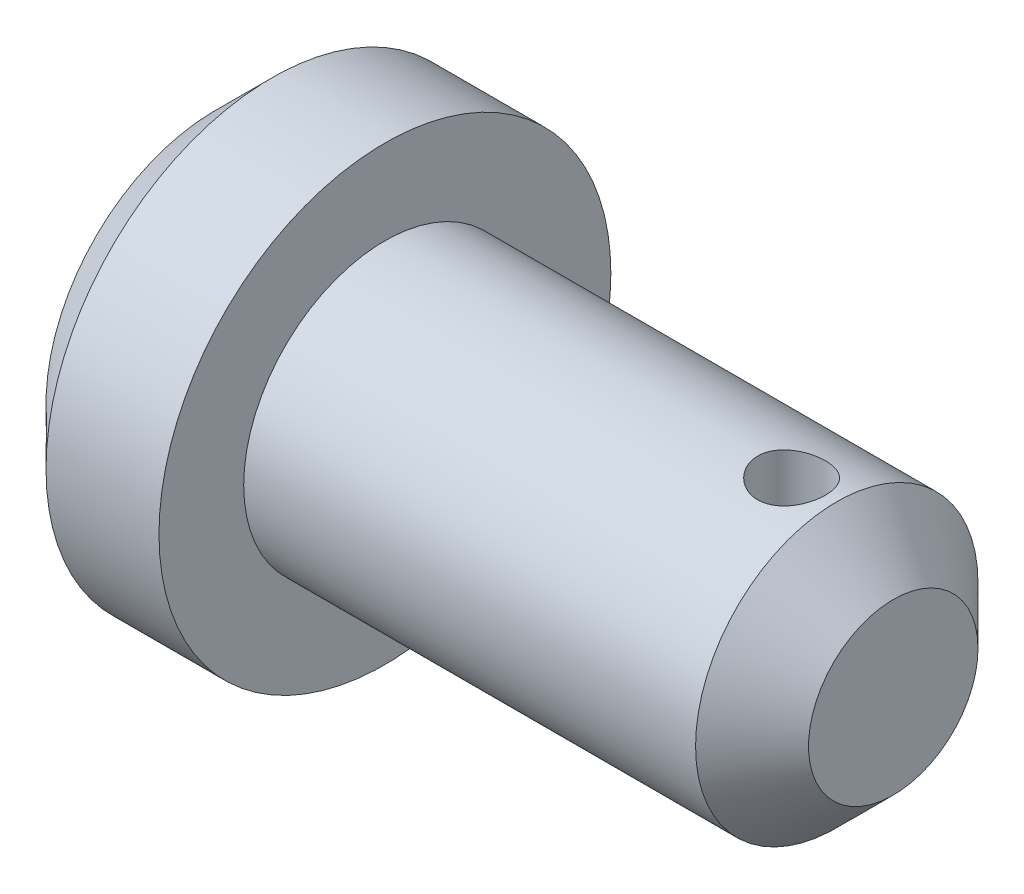
ISO-10303-21;
HEADER;
FILE_DESCRIPTION(('STEP AP214'),'2;1');
FILE_NAME('part.step','',(''),(''),'','','');
FILE_SCHEMA(('AUTOMOTIVE_DESIGN { 1 0 10303 214 1 1 1 1 }'));
ENDSEC;
DATA;
#1=APPLICATION_CONTEXT('core data for automotive mechanical design processes');
#2=APPLICATION_PROTOCOL_DEFINITION('international standard','automotive_design',2000,#1);
#3=PRODUCT_CONTEXT('',#1,'mechanical');
#4=PRODUCT('Part','Part','',(#3));
#5=PRODUCT_RELATED_PRODUCT_CATEGORY('part','',(#4));
#6=PRODUCT_DEFINITION_FORMATION('','',#4);
#7=PRODUCT_DEFINITION_CONTEXT('part definition',#1,'design');
#8=PRODUCT_DEFINITION('design','',#6,#7);
#9=PRODUCT_DEFINITION_SHAPE('','',#8);
#10=(LENGTH_UNIT() NAMED_UNIT(*) SI_UNIT(.MILLI.,.METRE.));
#11=(NAMED_UNIT(*) PLANE_ANGLE_UNIT() SI_UNIT($,.RADIAN.));
#12=(NAMED_UNIT(*) SI_UNIT($,.STERADIAN.) SOLID_ANGLE_UNIT());
#13=UNCERTAINTY_MEASURE_WITH_UNIT(LENGTH_MEASURE(1.E-05),#10,'distance_accuracy_value','');
#14=(GEOMETRIC_REPRESENTATION_CONTEXT(3) GLOBAL_UNCERTAINTY_ASSIGNED_CONTEXT((#13)) GLOBAL_UNIT_ASSIGNED_CONTEXT((#10,
#11,#12)) REPRESENTATION_CONTEXT('',''));
#15=CARTESIAN_POINT('',(0.,0.,0.));
#16=DIRECTION('',(0.,0.,1.));
#17=DIRECTION('',(1.,0.,0.));
#18=AXIS2_PLACEMENT_3D('',#15,#16,#17);
#19=CARTESIAN_POINT('',(30.,0.,0.));
#20=DIRECTION('',(-1.,0.,0.));
#21=DIRECTION('',(0.,0.,1.));
#22=AXIS2_PLACEMENT_3D('',#19,#20,#21);
#23=CYLINDRICAL_SURFACE('',#22,40.);
#24=CARTESIAN_POINT('',(9.99999999999999,0.,0.));
#25=DIRECTION('',(1.,0.,0.));
#26=DIRECTION('',(0.,0.,-1.));
#27=AXIS2_PLACEMENT_3D('',#24,#25,#26);
#28=CIRCLE('',#27,40.);
#29=CARTESIAN_POINT('',(9.99999999999999,0.,-40.));
#30=VERTEX_POINT('',#29);
#31=EDGE_CURVE('E103',#30,#30,#28,.T.);
#32=ORIENTED_EDGE('',*,*,#31,.T.);
#33=EDGE_LOOP('',(#32));
#34=FACE_BOUND('',#33,.T.);
#35=CARTESIAN_POINT('',(30.,0.,0.));
#36=DIRECTION('',(1.,0.,0.));
#37=DIRECTION('',(0.,0.,-1.));
#38=AXIS2_PLACEMENT_3D('',#35,#36,#37);
#39=CIRCLE('',#38,40.);
#40=CARTESIAN_POINT('',(30.,0.,-40.));
#41=VERTEX_POINT('',#40);
#42=EDGE_CURVE('E104',#41,#41,#39,.T.);
#43=ORIENTED_EDGE('',*,*,#42,.F.);
#44=EDGE_LOOP('',(#43));
#45=FACE_BOUND('',#44,.T.);
#46=ADVANCED_FACE('F33',(#34,#45),#23,.T.);
#47=CARTESIAN_POINT('',(30.,0.,0.));
#48=DIRECTION('',(1.,0.,0.));
#49=DIRECTION('',(0.,0.,-1.));
#50=AXIS2_PLACEMENT_3D('',#47,#48,#49);
#51=PLANE('',#50);
#52=CARTESIAN_POINT('',(30.,0.,0.));
#53=DIRECTION('',(1.,0.,0.));
#54=DIRECTION('',(0.,0.,-1.));
#55=AXIS2_PLACEMENT_3D('',#52,#53,#54);
#56=CIRCLE('',#55,25.);
#57=CARTESIAN_POINT('',(30.,0.,-25.));
#58=VERTEX_POINT('',#57);
#59=EDGE_CURVE('E106',#58,#58,#56,.T.);
#60=ORIENTED_EDGE('',*,*,#59,.F.);
#61=EDGE_LOOP('',(#60));
#62=FACE_BOUND('',#61,.T.);
#63=ORIENTED_EDGE('',*,*,#42,.T.);
#64=EDGE_LOOP('',(#63));
#65=FACE_BOUND('',#64,.T.);
#66=ADVANCED_FACE('F78',(#62,#65),#51,.T.);
#67=CARTESIAN_POINT('',(0.,0.,0.));
#68=DIRECTION('',(1.,0.,0.));
#69=DIRECTION('',(0.,0.,-1.));
#70=AXIS2_PLACEMENT_3D('',#67,#68,#69);
#71=PLANE('',#70);
#72=CARTESIAN_POINT('',(0.,0.,0.));
#73=DIRECTION('',(1.,0.,0.));
#74=DIRECTION('',(0.,0.,-1.));
#75=AXIS2_PLACEMENT_3D('',#72,#73,#74);
#76=CIRCLE('',#75,30.);
#77=CARTESIAN_POINT('',(0.,0.,-30.));
#78=VERTEX_POINT('',#77);
#79=EDGE_CURVE('E101',#78,#78,#76,.F.);
#80=ORIENTED_EDGE('',*,*,#79,.T.);
#81=EDGE_LOOP('',(#80));
#82=FACE_BOUND('',#81,.T.);
#83=ADVANCED_FACE('F84',(#82),#71,.F.);
#84=CARTESIAN_POINT('',(9.99999999999999,0.,0.));
#85=DIRECTION('',(1.,0.,0.));
#86=DIRECTION('',(0.,0.,-1.));
#87=AXIS2_PLACEMENT_3D('',#84,#85,#86);
#88=CONICAL_SURFACE('',#87,40.,0.785398163397451);
#89=ORIENTED_EDGE('',*,*,#79,.F.);
#90=EDGE_LOOP('',(#89));
#91=FACE_BOUND('',#90,.T.);
#92=ORIENTED_EDGE('',*,*,#31,.F.);
#93=EDGE_LOOP('',(#92));
#94=FACE_BOUND('',#93,.T.);
#95=ADVANCED_FACE('F74',(#91,#94),#88,.T.);
#96=CARTESIAN_POINT('',(120.,0.,0.));
#97=DIRECTION('',(-1.,0.,0.));
#98=DIRECTION('',(0.,0.,1.));
#99=AXIS2_PLACEMENT_3D('',#96,#97,#98);
#100=CYLINDRICAL_SURFACE('',#99,25.);
#101=CARTESIAN_POINT('',(102.,-24.2693221990232,6.));
#102=CARTESIAN_POINT('',(102.165940267579,-24.2693192173439,6.00000460058749));
#103=CARTESIAN_POINT('',(102.331829072138,-24.2710270328907,5.99311472313627));
#104=CARTESIAN_POINT('',(102.662445202232,-24.2777997433195,5.96562344868169));
#105=CARTESIAN_POINT('',(102.827172378041,-24.2828650632483,5.94502031563237));
#106=CARTESIAN_POINT('',(103.154279005195,-24.2962060432289,5.89025958920488));
#107=CARTESIAN_POINT('',(103.316657577368,-24.304482874777,5.85609704951731));
#108=CARTESIAN_POINT('',(103.637922323294,-24.324002012079,5.77448580831014));
#109=CARTESIAN_POINT('',(103.796807183095,-24.3352454135442,5.72703219729494));
#110=CARTESIAN_POINT('',(104.109665532697,-24.3603450339749,5.61930954739399));
#111=CARTESIAN_POINT('',(104.263646561787,-24.3741969907612,5.55906139358703));
#112=CARTESIAN_POINT('',(104.565988946917,-24.4041320001377,5.42613868912028));
#113=CARTESIAN_POINT('',(104.714348202337,-24.420215876438,5.35345954837853));
#114=CARTESIAN_POINT('',(105.00436163842,-24.4541500249133,5.19624934621714));
#115=CARTESIAN_POINT('',(105.146018303826,-24.471999634801,5.11172272360157));
#116=CARTESIAN_POINT('',(105.421830551282,-24.5089827826595,4.93135257338601));
#117=CARTESIAN_POINT('',(105.555983288685,-24.5281168015673,4.83550479634857));
#118=CARTESIAN_POINT('',(105.818212770223,-24.5674915774464,4.63134479435269));
#119=CARTESIAN_POINT('',(105.946137571354,-24.5877460219987,4.52284000132129));
#120=CARTESIAN_POINT('',(106.192484549593,-24.628482704143,4.29548353417837));
#121=CARTESIAN_POINT('',(106.310903182847,-24.6489650234755,4.17662803548193));
#122=CARTESIAN_POINT('',(106.537370685392,-24.6895792444555,3.92942214664513));
#123=CARTESIAN_POINT('',(106.645422412932,-24.7097112414296,3.80107439098764));
#124=CARTESIAN_POINT('',(106.850498764907,-24.749084932891,3.53564701496837));
#125=CARTESIAN_POINT('',(106.947519312517,-24.7683262966769,3.39856419538246));
#126=CARTESIAN_POINT('',(107.13094444839,-24.805612728147,3.11485061597086));
#127=CARTESIAN_POINT('',(107.217201722426,-24.8236399057151,2.96812218206264));
#128=CARTESIAN_POINT('',(107.377053409294,-24.8577272433076,2.66763492888514));
#129=CARTESIAN_POINT('',(107.450643042715,-24.8737866602544,2.51387348368351));
#130=CARTESIAN_POINT('',(107.584513266177,-24.9034639147108,2.20050084057474));
#131=CARTESIAN_POINT('',(107.644800196924,-24.917082914856,2.04089247207775));
#132=CARTESIAN_POINT('',(107.751635060819,-24.9415044760467,1.71693448898555));
#133=CARTESIAN_POINT('',(107.798178048838,-24.9523060231976,1.55258319115472));
#134=CARTESIAN_POINT('',(107.915008840054,-24.9796180760798,1.0604267514532));
#135=CARTESIAN_POINT('',(107.965175653471,-24.9916494382249,0.727223064781636));
#136=CARTESIAN_POINT('',(107.998140177668,-24.9995546719704,0.225051972672736));
#137=CARTESIAN_POINT('',(108.00207395387,-25.0004978214515,0.057200855693162));
#138=CARTESIAN_POINT('',(107.995889963377,-24.9990135577545,-0.278247999700324));
#139=CARTESIAN_POINT('',(107.985772022785,-24.9965861028638,-0.445845734952839));
#140=CARTESIAN_POINT('',(107.935074274527,-24.9844710986104,-0.939451198306505));
#141=CARTESIAN_POINT('',(107.874606280911,-24.9700581884779,-1.26352376365918));
#142=CARTESIAN_POINT('',(107.701816074803,-24.9299774285752,-1.89661000878181));
#143=CARTESIAN_POINT('',(107.589491228932,-24.9043090072343,-2.20562292291579));
#144=CARTESIAN_POINT('',(107.315226456392,-24.8441871252282,-2.80308340285013));
#145=CARTESIAN_POINT('',(107.152873521155,-24.8096609520016,-3.09133416391588));
#146=CARTESIAN_POINT('',(106.783473099971,-24.7355808399422,-3.63689114777195));
#147=CARTESIAN_POINT('',(106.576418389583,-24.6960260888452,-3.89419235819688));
#148=CARTESIAN_POINT('',(106.117369206923,-24.6150468786432,-4.37733250714646));
#149=CARTESIAN_POINT('',(105.864381270134,-24.5736003966327,-4.60222487048295));
#150=CARTESIAN_POINT('',(105.323848725212,-24.4944202534268,-5.00659136952867));
#151=CARTESIAN_POINT('',(105.0363027514,-24.4566867390692,-5.18606370943939));
#152=CARTESIAN_POINT('',(104.433069488263,-24.3891322466935,-5.4950396533725));
#153=CARTESIAN_POINT('',(104.117269898534,-24.3593449045093,-5.62433186444417));
#154=CARTESIAN_POINT('',(103.467533752573,-24.3114966451333,-5.82770650444349));
#155=CARTESIAN_POINT('',(103.133600749102,-24.2934334398264,-5.90179970658058));
#156=CARTESIAN_POINT('',(102.465813241367,-24.2715545321338,-5.99113700492853));
#157=CARTESIAN_POINT('',(102.132155860448,-24.2674017566251,-6.00777368474904));
#158=CARTESIAN_POINT('',(101.466833606381,-24.2728991225919,-5.98552405004056));
#159=CARTESIAN_POINT('',(101.13516856802,-24.2825481032417,-5.9466424049974));
#160=CARTESIAN_POINT('',(100.488308185549,-24.3142403018894,-5.81567711192227));
#161=CARTESIAN_POINT('',(100.172941722548,-24.3360979424442,-5.72438949541309));
#162=CARTESIAN_POINT('',(99.5619842842756,-24.3895714349639,-5.49207803402932));
#163=CARTESIAN_POINT('',(99.2663955116254,-24.421188371618,-5.35104866039818));
#164=CARTESIAN_POINT('',(98.6974427781538,-24.491337816706,-5.0202958832683));
#165=CARTESIAN_POINT('',(98.4245823154112,-24.529985907154,-4.82973151657672));
#166=CARTESIAN_POINT('',(97.9141974686284,-24.609553113729,-4.40637723136316));
#167=CARTESIAN_POINT('',(97.6766784260197,-24.6504725718652,-4.17358094176829));
#168=CARTESIAN_POINT('',(97.2381740435764,-24.7311017019711,-3.66607172916322));
#169=CARTESIAN_POINT('',(97.0381478121625,-24.770762345906,-3.39052236174369));
#170=CARTESIAN_POINT('',(96.6871677504673,-24.8434406642277,-2.80874047615625));
#171=CARTESIAN_POINT('',(96.5362114256,-24.8764586762761,-2.50250951879601));
#172=CARTESIAN_POINT('',(96.3506355476032,-24.9181020803638,-2.02815096730082));
#173=CARTESIAN_POINT('',(96.2956917559489,-24.9306431435962,-1.86803584664664));
#174=CARTESIAN_POINT('',(96.1994846335862,-24.9528307363167,-1.54356696295539));
#175=CARTESIAN_POINT('',(96.1582161740161,-24.9624783508485,-1.3792148139756));
#176=CARTESIAN_POINT('',(96.0897096887009,-24.9785993962541,-1.04746058126015));
#177=CARTESIAN_POINT('',(96.0624723719879,-24.9850726667188,-0.880058343837638));
#178=CARTESIAN_POINT('',(96.0222598144282,-24.994659296045,-0.54345594522283));
#179=CARTESIAN_POINT('',(96.0092839612402,-24.997772799164,-0.374255861539252));
#180=CARTESIAN_POINT('',(95.9978529891506,-25.0005148115007,-0.0395721662635981));
#181=CARTESIAN_POINT('',(95.9990434297774,-25.0002283873103,0.125898766906482));
#182=CARTESIAN_POINT('',(96.0150800992914,-24.9963838456846,0.456136647513661));
#183=CARTESIAN_POINT('',(96.0299260318547,-24.9928257992435,0.620903610148958));
#184=CARTESIAN_POINT('',(96.0731527400705,-24.9825354772041,0.94857569649803));
#185=CARTESIAN_POINT('',(96.1015355520261,-24.9758027240481,1.11148053632313));
#186=CARTESIAN_POINT('',(96.1715911898645,-24.9593507893913,1.434191004048));
#187=CARTESIAN_POINT('',(96.2132593039809,-24.9496326667265,1.59399770944887));
#188=CARTESIAN_POINT('',(96.309349246711,-24.9275215666658,1.90878490028135));
#189=CARTESIAN_POINT('',(96.3637156829956,-24.9151402247435,2.06378312590839));
#190=CARTESIAN_POINT('',(96.4848611471134,-24.8880146824749,2.36857079597771));
#191=CARTESIAN_POINT('',(96.5516358370964,-24.8732713081285,2.51836203909183));
#192=CARTESIAN_POINT('',(96.6971524327788,-24.841802398867,2.81187682420641));
#193=CARTESIAN_POINT('',(96.7758995375637,-24.8250760035128,2.95559769529926));
#194=CARTESIAN_POINT('',(96.9447566902079,-24.7900921246488,3.23593617076046));
#195=CARTESIAN_POINT('',(97.0348629565684,-24.7718351513474,3.37255611776949));
#196=CARTESIAN_POINT('',(97.228022577442,-24.7338351675459,3.64090348698623));
#197=CARTESIAN_POINT('',(97.3313235133422,-24.7140678232284,3.77244930795077));
#198=CARTESIAN_POINT('',(97.5484552306476,-24.6739715765701,4.02636882328124));
#199=CARTESIAN_POINT('',(97.6622823938778,-24.6536428688592,4.14874564331391));
#200=CARTESIAN_POINT('',(97.8998153905987,-24.6129603609016,4.38365180469934));
#201=CARTESIAN_POINT('',(98.0235271315938,-24.5926065529162,4.49617517167718));
#202=CARTESIAN_POINT('',(98.2799146383274,-24.5524543239015,4.71050671781096));
#203=CARTESIAN_POINT('',(98.4125871297228,-24.532655703704,4.81231877656933));
#204=CARTESIAN_POINT('',(98.6884373735082,-24.4938254842292,5.00624248933444));
#205=CARTESIAN_POINT('',(98.8317568635018,-24.474813007441,5.09815651544128));
#206=CARTESIAN_POINT('',(99.1257943083088,-24.4384897622653,5.26952462166943));
#207=CARTESIAN_POINT('',(99.2765095144213,-24.4211783687267,5.34898328559685));
#208=CARTESIAN_POINT('',(99.5842827159965,-24.3887740639133,5.49484184745972));
#209=CARTESIAN_POINT('',(99.7413376350791,-24.3736800927344,5.56124798952492));
#210=CARTESIAN_POINT('',(100.060684482131,-24.3461620490209,5.6805037284954));
#211=CARTESIAN_POINT('',(100.22297555914,-24.3337375451432,5.7333555158345));
#212=CARTESIAN_POINT('',(100.649055597245,-24.3054947105591,5.85223691155717));
#213=CARTESIAN_POINT('',(100.916073592026,-24.2920191452792,5.90755575023753));
#214=CARTESIAN_POINT('',(101.455440807673,-24.2739356520306,5.98143220718613));
#215=CARTESIAN_POINT('',(101.727789646058,-24.2693270902047,5.99999245314254));
#216=CARTESIAN_POINT('',(102.,-24.2693221990232,6.));
#217=B_SPLINE_CURVE_WITH_KNOTS('',3,(#101,#102,#103,#104,#105,#106,#107,#108,#109,#110,#111,
#112,#113,#114,#115,#116,#117,#118,#119,#120,#121,#122,#123,#124,#125,#126,#127,#128,#129,#130,
#131,#132,#133,#134,#135,#136,#137,#138,#139,#140,#141,#142,#143,#144,#145,#146,#147,#148,#149,
#150,#151,#152,#153,#154,#155,#156,#157,#158,#159,#160,#161,#162,#163,#164,#165,#166,#167,#168,
#169,#170,#171,#172,#173,#174,#175,#176,#177,#178,#179,#180,#181,#182,#183,#184,#185,#186,#187,
#188,#189,#190,#191,#192,#193,#194,#195,#196,#197,#198,#199,#200,#201,#202,#203,#204,#205,#206,
#207,#208,#209,#210,#211,#212,#213,#214,#215,#216),.UNSPECIFIED.,.T.,.F.,(4,2,2,2,2,2,2,2,2,2,2,
2,2,2,2,2,2,2,2,2,2,2,2,2,2,2,2,2,2,2,2,2,2,2,2,2,2,2,2,2,2,2,2,2,2,2,2,2,2,2,2,2,2,2,2,2,2,4),
(0.,0.49758059138039,0.995224186553656,1.4930494832496,1.99105891120689,2.48826158123245,
2.98564823885732,3.48284904015122,3.98023706425766,4.48653742340698,4.99302566076187,
5.4993738510141,6.00590856964271,6.51875380835026,7.03179211782624,7.54458535785561,
8.05756287894231,9.06317072582739,9.56637068685642,10.0695768752428,11.0544731736286,
12.0394194922331,13.0327253814724,14.0261919233719,15.0444773123883,16.0628029556732,
17.0853730875996,18.1077435918426,19.1051538629732,20.10248024975,21.0850439079104,
22.0677168116698,23.0683069952269,24.0690482527067,25.0926627677996,26.1162252368616,
26.624940138715,27.1334640332021,27.6420136222755,28.1505413750131,28.6463730888496,
29.1421940434048,29.6380896060201,30.1338094895389,30.6274060608767,31.1208303973834,
31.6144696213306,32.1079449431356,32.6126284711584,33.1171391648262,33.6219536669565,
34.1265846927702,34.6399206216221,35.1530671874622,35.6659676710412,36.1787852157025,
36.9950805869967,37.8113176033061),.UNSPECIFIED.);
#218=CARTESIAN_POINT('',(102.,-24.2693221990232,6.));
#219=VERTEX_POINT('',#218);
#220=EDGE_CURVE('E38',#219,#219,#217,.T.);
#221=ORIENTED_EDGE('',*,*,#220,.T.);
#222=EDGE_LOOP('',(#221));
#223=FACE_BOUND('',#222,.T.);
#224=CARTESIAN_POINT('',(102.,24.2693221990232,6.));
#225=CARTESIAN_POINT('',(101.834059732421,24.2693192173439,6.00000460058749));
#226=CARTESIAN_POINT('',(101.668170927862,24.2710270328907,5.99311472313627));
#227=CARTESIAN_POINT('',(101.337554797768,24.2777997433195,5.96562344868169));
#228=CARTESIAN_POINT('',(101.172827621959,24.2828650632483,5.94502031563237));
#229=CARTESIAN_POINT('',(100.845720994805,24.2962060432289,5.89025958920488));
#230=CARTESIAN_POINT('',(100.683342422632,24.304482874777,5.85609704951731));
#231=CARTESIAN_POINT('',(100.362077676706,24.324002012079,5.77448580831014));
#232=CARTESIAN_POINT('',(100.203192816905,24.3352454135442,5.72703219729494));
#233=CARTESIAN_POINT('',(99.8903344673029,24.3603450339749,5.61930954739399));
#234=CARTESIAN_POINT('',(99.7363534382128,24.3741969907612,5.55906139358703));
#235=CARTESIAN_POINT('',(99.4340110530831,24.4041320001377,5.42613868912028));
#236=CARTESIAN_POINT('',(99.2856517976634,24.420215876438,5.35345954837853));
#237=CARTESIAN_POINT('',(98.9956383615798,24.4541500249133,5.19624934621714));
#238=CARTESIAN_POINT('',(98.8539816961744,24.471999634801,5.11172272360157));
#239=CARTESIAN_POINT('',(98.5781694487184,24.5089827826595,4.93135257338601));
#240=CARTESIAN_POINT('',(98.4440167113146,24.5281168015673,4.83550479634857));
#241=CARTESIAN_POINT('',(98.1817872297769,24.5674915774464,4.63134479435269));
#242=CARTESIAN_POINT('',(98.0538624286457,24.5877460219987,4.52284000132129));
#243=CARTESIAN_POINT('',(97.8075154504067,24.628482704143,4.29548353417838));
#244=CARTESIAN_POINT('',(97.6890968171529,24.6489650234755,4.17662803548193));
#245=CARTESIAN_POINT('',(97.4626293146081,24.6895792444555,3.92942214664513));
#246=CARTESIAN_POINT('',(97.3545775870675,24.7097112414296,3.80107439098764));
#247=CARTESIAN_POINT('',(97.1495012350933,24.749084932891,3.53564701496838));
#248=CARTESIAN_POINT('',(97.0524806874831,24.7683262966769,3.39856419538247));
#249=CARTESIAN_POINT('',(96.86905555161,24.805612728147,3.11485061597086));
#250=CARTESIAN_POINT('',(96.7827982775735,24.8236399057151,2.96812218206264));
#251=CARTESIAN_POINT('',(96.6229465907055,24.8577272433076,2.66763492888514));
#252=CARTESIAN_POINT('',(96.5493569572847,24.8737866602543,2.51387348368352));
#253=CARTESIAN_POINT('',(96.4154867338232,24.9034639147108,2.20050084057475));
#254=CARTESIAN_POINT('',(96.3551998030764,24.917082914856,2.04089247207776));
#255=CARTESIAN_POINT('',(96.2483649391805,24.9415044760467,1.71693448898557));
#256=CARTESIAN_POINT('',(96.2018219511619,24.9523060231976,1.55258319115474));
#257=CARTESIAN_POINT('',(96.0849911599461,24.9796180760798,1.06042675145321));
#258=CARTESIAN_POINT('',(96.0348243465292,24.9916494382249,0.727223064781647));
#259=CARTESIAN_POINT('',(96.0018598223319,24.9995546719704,0.225051972672745));
#260=CARTESIAN_POINT('',(95.9979260461296,25.0004978214515,0.0572008556931701));
#261=CARTESIAN_POINT('',(96.0041100366233,24.9990135577545,-0.278247999700317));
#262=CARTESIAN_POINT('',(96.014227977215,24.9965861028638,-0.445845734952833));
#263=CARTESIAN_POINT('',(96.0649257254733,24.9844710986104,-0.9394511983065));
#264=CARTESIAN_POINT('',(96.1253937190891,24.9700581884779,-1.26352376365918));
#265=CARTESIAN_POINT('',(96.2981839251966,24.9299774285752,-1.89661000878181));
#266=CARTESIAN_POINT('',(96.4105087710679,24.9043090072343,-2.20562292291579));
#267=CARTESIAN_POINT('',(96.6847735436076,24.8441871252282,-2.80308340285013));
#268=CARTESIAN_POINT('',(96.8471264788453,24.8096609520016,-3.09133416391587));
#269=CARTESIAN_POINT('',(97.2165269000294,24.7355808399422,-3.63689114777194));
#270=CARTESIAN_POINT('',(97.423581610417,24.6960260888452,-3.89419235819688));
#271=CARTESIAN_POINT('',(97.8826307930772,24.6150468786432,-4.37733250714646));
#272=CARTESIAN_POINT('',(98.1356187298665,24.5736003966327,-4.60222487048295));
#273=CARTESIAN_POINT('',(98.6761512747884,24.4944202534268,-5.00659136952868));
#274=CARTESIAN_POINT('',(98.9636972486,24.4566867390692,-5.18606370943939));
#275=CARTESIAN_POINT('',(99.5669305117367,24.3891322466935,-5.4950396533725));
#276=CARTESIAN_POINT('',(99.8827301014658,24.3593449045093,-5.62433186444417));
#277=CARTESIAN_POINT('',(100.532466247427,24.3114966451333,-5.82770650444349));
#278=CARTESIAN_POINT('',(100.866399250898,24.2934334398264,-5.90179970658058));
#279=CARTESIAN_POINT('',(101.534186758633,24.2715545321338,-5.99113700492853));
#280=CARTESIAN_POINT('',(101.867844139552,24.2674017566251,-6.00777368474904));
#281=CARTESIAN_POINT('',(102.533166393619,24.2728991225919,-5.98552405004056));
#282=CARTESIAN_POINT('',(102.86483143198,24.2825481032417,-5.9466424049974));
#283=CARTESIAN_POINT('',(103.511691814451,24.3142403018894,-5.81567711192227));
#284=CARTESIAN_POINT('',(103.827058277452,24.3360979424442,-5.7243894954131));
#285=CARTESIAN_POINT('',(104.438015715724,24.3895714349639,-5.49207803402933));
#286=CARTESIAN_POINT('',(104.733604488375,24.4211883716179,-5.35104866039819));
#287=CARTESIAN_POINT('',(105.302557221846,24.491337816706,-5.02029588326831));
#288=CARTESIAN_POINT('',(105.575417684589,24.529985907154,-4.82973151657672));
#289=CARTESIAN_POINT('',(106.085802531372,24.609553113729,-4.40637723136316));
#290=CARTESIAN_POINT('',(106.32332157398,24.6504725718652,-4.17358094176829));
#291=CARTESIAN_POINT('',(106.761825956424,24.7311017019711,-3.66607172916322));
#292=CARTESIAN_POINT('',(106.961852187838,24.770762345906,-3.3905223617437));
#293=CARTESIAN_POINT('',(107.312832249533,24.8434406642277,-2.80874047615625));
#294=CARTESIAN_POINT('',(107.4637885744,24.8764586762761,-2.50250951879602));
#295=CARTESIAN_POINT('',(107.649364452397,24.9181020803638,-2.02815096730083));
#296=CARTESIAN_POINT('',(107.704308244051,24.9306431435962,-1.86803584664665));
#297=CARTESIAN_POINT('',(107.800515366414,24.9528307363167,-1.5435669629554));
#298=CARTESIAN_POINT('',(107.841783825984,24.9624783508485,-1.37921481397561));
#299=CARTESIAN_POINT('',(107.910290311299,24.9785993962541,-1.04746058126016));
#300=CARTESIAN_POINT('',(107.937527628012,24.9850726667188,-0.880058343837643));
#301=CARTESIAN_POINT('',(107.977740185572,24.994659296045,-0.543455945222834));
#302=CARTESIAN_POINT('',(107.99071603876,24.997772799164,-0.374255861539256));
#303=CARTESIAN_POINT('',(108.002147010849,25.0005148115007,-0.0395721662636037));
#304=CARTESIAN_POINT('',(108.000956570223,25.0002283873103,0.125898766906475));
#305=CARTESIAN_POINT('',(107.984919900709,24.9963838456846,0.456136647513655));
#306=CARTESIAN_POINT('',(107.970073968145,24.9928257992435,0.620903610148952));
#307=CARTESIAN_POINT('',(107.926847259929,24.9825354772041,0.948575696498026));
#308=CARTESIAN_POINT('',(107.898464447974,24.9758027240481,1.11148053632312));
#309=CARTESIAN_POINT('',(107.828408810135,24.9593507893913,1.434191004048));
#310=CARTESIAN_POINT('',(107.786740696019,24.9496326667265,1.59399770944887));
#311=CARTESIAN_POINT('',(107.690650753289,24.9275215666658,1.90878490028135));
#312=CARTESIAN_POINT('',(107.636284317004,24.9151402247435,2.06378312590839));
#313=CARTESIAN_POINT('',(107.515138852887,24.8880146824749,2.36857079597771));
#314=CARTESIAN_POINT('',(107.448364162904,24.8732713081285,2.51836203909183));
#315=CARTESIAN_POINT('',(107.302847567221,24.841802398867,2.81187682420642));
#316=CARTESIAN_POINT('',(107.224100462436,24.8250760035128,2.95559769529926));
#317=CARTESIAN_POINT('',(107.055243309792,24.7900921246488,3.23593617076046));
#318=CARTESIAN_POINT('',(106.965137043432,24.7718351513474,3.37255611776949));
#319=CARTESIAN_POINT('',(106.771977422558,24.7338351675459,3.64090348698623));
#320=CARTESIAN_POINT('',(106.668676486658,24.7140678232284,3.77244930795078));
#321=CARTESIAN_POINT('',(106.451544769352,24.6739715765701,4.02636882328125));
#322=CARTESIAN_POINT('',(106.337717606122,24.6536428688592,4.14874564331391));
#323=CARTESIAN_POINT('',(106.100184609401,24.6129603609016,4.38365180469935));
#324=CARTESIAN_POINT('',(105.976472868406,24.5926065529162,4.49617517167719));
#325=CARTESIAN_POINT('',(105.720085361673,24.5524543239015,4.71050671781096));
#326=CARTESIAN_POINT('',(105.587412870277,24.532655703704,4.81231877656934));
#327=CARTESIAN_POINT('',(105.311562626492,24.4938254842292,5.00624248933444));
#328=CARTESIAN_POINT('',(105.168243136498,24.474813007441,5.09815651544129));
#329=CARTESIAN_POINT('',(104.874205691691,24.4384897622653,5.26952462166943));
#330=CARTESIAN_POINT('',(104.723490485579,24.4211783687267,5.34898328559685));
#331=CARTESIAN_POINT('',(104.415717284004,24.3887740639133,5.49484184745972));
#332=CARTESIAN_POINT('',(104.258662364921,24.3736800927344,5.56124798952492));
#333=CARTESIAN_POINT('',(103.939315517869,24.3461620490209,5.6805037284954));
#334=CARTESIAN_POINT('',(103.77702444086,24.3337375451432,5.7333555158345));
#335=CARTESIAN_POINT('',(103.350944402755,24.3054947105591,5.85223691155717));
#336=CARTESIAN_POINT('',(103.083926407974,24.2920191452792,5.90755575023753));
#337=CARTESIAN_POINT('',(102.544559192327,24.2739356520306,5.98143220718613));
#338=CARTESIAN_POINT('',(102.272210353942,24.2693270902047,5.99999245314254));
#339=CARTESIAN_POINT('',(102.,24.2693221990232,6.));
#340=B_SPLINE_CURVE_WITH_KNOTS('',3,(#224,#225,#226,#227,#228,#229,#230,#231,#232,#233,#234,
#235,#236,#237,#238,#239,#240,#241,#242,#243,#244,#245,#246,#247,#248,#249,#250,#251,#252,#253,
#254,#255,#256,#257,#258,#259,#260,#261,#262,#263,#264,#265,#266,#267,#268,#269,#270,#271,#272,
#273,#274,#275,#276,#277,#278,#279,#280,#281,#282,#283,#284,#285,#286,#287,#288,#289,#290,#291,
#292,#293,#294,#295,#296,#297,#298,#299,#300,#301,#302,#303,#304,#305,#306,#307,#308,#309,#310,
#311,#312,#313,#314,#315,#316,#317,#318,#319,#320,#321,#322,#323,#324,#325,#326,#327,#328,#329,
#330,#331,#332,#333,#334,#335,#336,#337,#338,#339),.UNSPECIFIED.,.T.,.F.,(4,2,2,2,2,2,2,2,2,2,2,
2,2,2,2,2,2,2,2,2,2,2,2,2,2,2,2,2,2,2,2,2,2,2,2,2,2,2,2,2,2,2,2,2,2,2,2,2,2,2,2,2,2,2,2,2,2,4),
(0.,0.49758059138039,0.995224186553656,1.4930494832496,1.99105891120689,2.48826158123245,
2.98564823885731,3.48284904015122,3.98023706425766,4.48653742340697,4.99302566076186,
5.4993738510141,6.00590856964271,6.51875380835025,7.03179211782623,7.54458535785559,
8.05756287894229,9.06317072582738,9.56637068685641,10.0695768752428,11.0544731736285,
12.0394194922331,13.0327253814724,14.0261919233719,15.0444773123883,16.0628029556731,
17.0853730875996,18.1077435918426,19.1051538629732,20.10248024975,21.0850439079103,
22.0677168116698,23.0683069952269,24.0690482527067,25.0926627677996,26.1162252368616,
26.624940138715,27.1334640332021,27.6420136222755,28.150541375013,28.6463730888496,
29.1421940434048,29.6380896060201,30.1338094895388,30.6274060608767,31.1208303973834,
31.6144696213306,32.1079449431356,32.6126284711584,33.1171391648262,33.6219536669565,
34.1265846927702,34.6399206216221,35.1530671874622,35.6659676710412,36.1787852157025,
36.9950805869967,37.8113176033061),.UNSPECIFIED.);
#341=CARTESIAN_POINT('',(102.,24.2693221990232,6.));
#342=VERTEX_POINT('',#341);
#343=EDGE_CURVE('E10',#342,#342,#340,.T.);
#344=ORIENTED_EDGE('',*,*,#343,.T.);
#345=EDGE_LOOP('',(#344));
#346=FACE_BOUND('',#345,.T.);
#347=CARTESIAN_POINT('',(110.,0.,0.));
#348=DIRECTION('',(1.,0.,0.));
#349=DIRECTION('',(0.,0.,-1.));
#350=AXIS2_PLACEMENT_3D('',#347,#348,#349);
#351=CIRCLE('',#350,25.);
#352=CARTESIAN_POINT('',(110.,0.,-25.));
#353=VERTEX_POINT('',#352);
#354=EDGE_CURVE('E47',#353,#353,#351,.F.);
#355=ORIENTED_EDGE('',*,*,#354,.T.);
#356=EDGE_LOOP('',(#355));
#357=FACE_BOUND('',#356,.T.);
#358=ORIENTED_EDGE('',*,*,#59,.T.);
#359=EDGE_LOOP('',(#358));
#360=FACE_BOUND('',#359,.T.);
#361=ADVANCED_FACE('F57',(#223,#346,#357,#360),#100,.T.);
#362=CARTESIAN_POINT('',(120.,0.,0.));
#363=DIRECTION('',(1.,0.,0.));
#364=DIRECTION('',(0.,0.,-1.));
#365=AXIS2_PLACEMENT_3D('',#362,#363,#364);
#366=PLANE('',#365);
#367=CARTESIAN_POINT('',(120.,0.,0.));
#368=DIRECTION('',(1.,0.,0.));
#369=DIRECTION('',(0.,0.,-1.));
#370=AXIS2_PLACEMENT_3D('',#367,#368,#369);
#371=CIRCLE('',#370,15.0000000000001);
#372=CARTESIAN_POINT('',(120.,0.,-15.0000000000001));
#373=VERTEX_POINT('',#372);
#374=EDGE_CURVE('E51',#373,#373,#371,.T.);
#375=ORIENTED_EDGE('',*,*,#374,.T.);
#376=EDGE_LOOP('',(#375));
#377=FACE_BOUND('',#376,.T.);
#378=ADVANCED_FACE('F65',(#377),#366,.T.);
#379=CARTESIAN_POINT('',(120.,0.,0.));
#380=DIRECTION('',(-1.,0.,0.));
#381=DIRECTION('',(0.,0.,1.));
#382=AXIS2_PLACEMENT_3D('',#379,#380,#381);
#383=CONICAL_SURFACE('',#382,15.0000000000001,0.785398163397448);
#384=ORIENTED_EDGE('',*,*,#354,.F.);
#385=EDGE_LOOP('',(#384));
#386=FACE_BOUND('',#385,.T.);
#387=ORIENTED_EDGE('',*,*,#374,.F.);
#388=EDGE_LOOP('',(#387));
#389=FACE_BOUND('',#388,.T.);
#390=ADVANCED_FACE('F36',(#386,#389),#383,.T.);
#391=CARTESIAN_POINT('',(102.,-65.,0.));
#392=DIRECTION('',(0.,1.,0.));
#393=DIRECTION('',(0.,0.,1.));
#394=AXIS2_PLACEMENT_3D('',#391,#392,#393);
#395=CYLINDRICAL_SURFACE('',#394,6.);
#396=ORIENTED_EDGE('',*,*,#343,.F.);
#397=EDGE_LOOP('',(#396));
#398=FACE_BOUND('',#397,.T.);
#399=ORIENTED_EDGE('',*,*,#220,.F.);
#400=EDGE_LOOP('',(#399));
#401=FACE_BOUND('',#400,.T.);
#402=ADVANCED_FACE('F61',(#398,#401),#395,.F.);
#403=CLOSED_SHELL('',(#46,#66,#83,#95,#361,#378,#390,#402));
#404=MANIFOLD_SOLID_BREP('B2',#403);
#405=ADVANCED_BREP_SHAPE_REPRESENTATION('',(#18,#404),#14);
#406=SHAPE_DEFINITION_REPRESENTATION(#9,#405);
ENDSEC;
END-ISO-10303-21;
